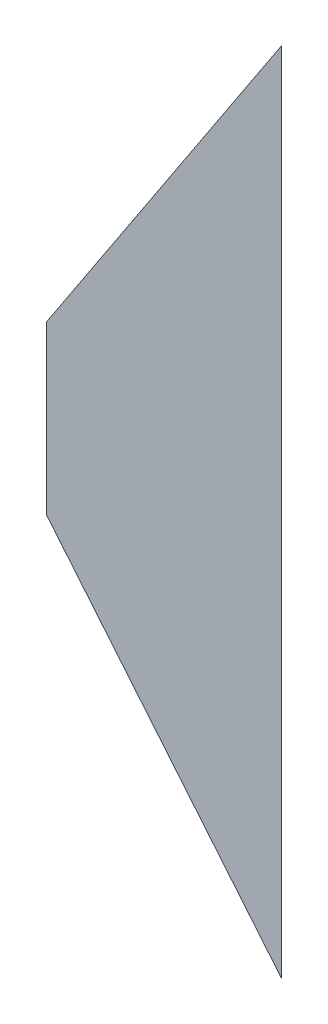
ISO-10303-21;
HEADER;
FILE_DESCRIPTION(('STEP AP214'),'2;1');
FILE_NAME('part.step','',(''),(''),'','','');
FILE_SCHEMA(('AUTOMOTIVE_DESIGN { 1 0 10303 214 1 1 1 1 }'));
ENDSEC;
DATA;
#1=APPLICATION_CONTEXT('core data for automotive mechanical design processes');
#2=APPLICATION_PROTOCOL_DEFINITION('international standard','automotive_design',2000,#1);
#3=PRODUCT_CONTEXT('',#1,'mechanical');
#4=PRODUCT('Part','Part','',(#3));
#5=PRODUCT_RELATED_PRODUCT_CATEGORY('part','',(#4));
#6=PRODUCT_DEFINITION_FORMATION('','',#4);
#7=PRODUCT_DEFINITION_CONTEXT('part definition',#1,'design');
#8=PRODUCT_DEFINITION('design','',#6,#7);
#9=PRODUCT_DEFINITION_SHAPE('','',#8);
#10=(LENGTH_UNIT() NAMED_UNIT(*) SI_UNIT(.MILLI.,.METRE.));
#11=(NAMED_UNIT(*) PLANE_ANGLE_UNIT() SI_UNIT($,.RADIAN.));
#12=(NAMED_UNIT(*) SI_UNIT($,.STERADIAN.) SOLID_ANGLE_UNIT());
#13=UNCERTAINTY_MEASURE_WITH_UNIT(LENGTH_MEASURE(1.E-05),#10,'distance_accuracy_value','');
#14=(GEOMETRIC_REPRESENTATION_CONTEXT(3) GLOBAL_UNCERTAINTY_ASSIGNED_CONTEXT((#13)) GLOBAL_UNIT_ASSIGNED_CONTEXT((#10,
#11,#12)) REPRESENTATION_CONTEXT('',''));
#15=CARTESIAN_POINT('',(0.,0.,0.));
#16=DIRECTION('',(0.,0.,1.));
#17=DIRECTION('',(1.,0.,0.));
#18=AXIS2_PLACEMENT_3D('',#15,#16,#17);
#19=CARTESIAN_POINT('',(0.,0.,0.));
#20=DIRECTION('',(1.,0.,0.));
#21=DIRECTION('',(0.,0.,-1.));
#22=AXIS2_PLACEMENT_3D('',#19,#20,#21);
#23=PLANE('',#22);
#24=DIRECTION('',(0.,0.,1.));
#25=VECTOR('',#24,1.);
#26=CARTESIAN_POINT('',(0.,0.,-2.6));
#27=LINE('',#26,#25);
#28=CARTESIAN_POINT('',(0.,0.,-2.6));
#29=VERTEX_POINT('',#28);
#30=CARTESIAN_POINT('',(0.,0.,0.));
#31=VERTEX_POINT('',#30);
#32=EDGE_CURVE('E81',#29,#31,#27,.T.);
#33=ORIENTED_EDGE('',*,*,#32,.F.);
#34=DIRECTION('',(0.,1.,0.));
#35=VECTOR('',#34,1.);
#36=CARTESIAN_POINT('',(0.,-5.00000000000001,-2.6));
#37=LINE('',#36,#35);
#38=CARTESIAN_POINT('',(0.,-5.00000000000001,-2.6));
#39=VERTEX_POINT('',#38);
#40=EDGE_CURVE('E71',#39,#29,#37,.T.);
#41=ORIENTED_EDGE('',*,*,#40,.F.);
#42=DIRECTION('',(0.,0.,-1.));
#43=VECTOR('',#42,1.);
#44=CARTESIAN_POINT('',(0.,-5.00000000000001,0.));
#45=LINE('',#44,#43);
#46=CARTESIAN_POINT('',(0.,-5.00000000000001,0.));
#47=VERTEX_POINT('',#46);
#48=EDGE_CURVE('E97',#47,#39,#45,.T.);
#49=ORIENTED_EDGE('',*,*,#48,.F.);
#50=DIRECTION('',(0.,-1.,0.));
#51=VECTOR('',#50,1.);
#52=CARTESIAN_POINT('',(0.,0.,0.));
#53=LINE('',#52,#51);
#54=EDGE_CURVE('E101',#31,#47,#53,.T.);
#55=ORIENTED_EDGE('',*,*,#54,.F.);
#56=EDGE_LOOP('',(#33,#41,#49,#55));
#57=FACE_BOUND('',#56,.T.);
#58=ADVANCED_FACE('F37',(#57),#23,.F.);
#59=CARTESIAN_POINT('',(6.9999999999996,-13.4585481156725,0.));
#60=DIRECTION('',(0.,0.,-1.));
#61=DIRECTION('',(-1.,0.,0.));
#62=AXIS2_PLACEMENT_3D('',#59,#60,#61);
#63=PLANE('',#62);
#64=DIRECTION('',(0.,1.,0.));
#65=VECTOR('',#64,1.);
#66=CARTESIAN_POINT('',(6.9999999999996,-13.4585481156725,0.));
#67=LINE('',#66,#65);
#68=CARTESIAN_POINT('',(6.9999999999996,-13.4585481156725,0.));
#69=VERTEX_POINT('',#68);
#70=CARTESIAN_POINT('',(6.99999999999957,10.6243556529812,0.));
#71=VERTEX_POINT('',#70);
#72=EDGE_CURVE('E87',#69,#71,#67,.T.);
#73=ORIENTED_EDGE('',*,*,#72,.T.);
#74=DIRECTION('',(-0.550180959322901,-0.835045455049324,0.));
#75=VECTOR('',#74,1.);
#76=CARTESIAN_POINT('',(6.99999999999957,10.6243556529812,0.));
#77=LINE('',#76,#75);
#78=EDGE_CURVE('E48',#71,#31,#77,.T.);
#79=ORIENTED_EDGE('',*,*,#78,.T.);
#80=ORIENTED_EDGE('',*,*,#54,.T.);
#81=DIRECTION('',(0.637558105394034,-0.77040227300182,0.));
#82=VECTOR('',#81,1.);
#83=CARTESIAN_POINT('',(0.,-5.00000000000001,0.));
#84=LINE('',#83,#82);
#85=EDGE_CURVE('E12',#47,#69,#84,.T.);
#86=ORIENTED_EDGE('',*,*,#85,.T.);
#87=EDGE_LOOP('',(#73,#79,#80,#86));
#88=FACE_BOUND('',#87,.T.);
#89=ADVANCED_FACE('F137',(#88),#63,.F.);
#90=CARTESIAN_POINT('',(0.,0.,0.));
#91=DIRECTION('',(-0.835045455049324,0.550180959322901,0.));
#92=DIRECTION('',(0.550180959322901,0.835045455049324,0.));
#93=AXIS2_PLACEMENT_3D('',#90,#91,#92);
#94=PLANE('',#93);
#95=ORIENTED_EDGE('',*,*,#78,.F.);
#96=DIRECTION('',(-0.539040867315305,-0.818137412264233,-0.200215179288554));
#97=VECTOR('',#96,1.);
#98=CARTESIAN_POINT('',(3.49999999999979,5.31217782649062,-1.3));
#99=LINE('',#98,#97);
#100=EDGE_CURVE('E78',#71,#29,#99,.T.);
#101=ORIENTED_EDGE('',*,*,#100,.T.);
#102=ORIENTED_EDGE('',*,*,#32,.T.);
#103=EDGE_LOOP('',(#95,#101,#102));
#104=FACE_BOUND('',#103,.T.);
#105=ADVANCED_FACE('F80',(#104),#94,.T.);
#106=CARTESIAN_POINT('',(-1.83410242090568,-2.78373663195673,-3.28123804205072));
#107=DIRECTION('',(-0.348186529603645,0.,0.937425272009758));
#108=DIRECTION('',(0.937425272009759,0.,0.348186529603645));
#109=AXIS2_PLACEMENT_3D('',#106,#107,#108);
#110=PLANE('',#109);
#111=DIRECTION('',(-0.620400067205516,0.749669117060658,-0.230434310676348));
#112=VECTOR('',#111,1.);
#113=CARTESIAN_POINT('',(6.9999999999996,-13.4585481156725,0.));
#114=LINE('',#113,#112);
#115=EDGE_CURVE('E88',#69,#39,#114,.T.);
#116=ORIENTED_EDGE('',*,*,#115,.T.);
#117=ORIENTED_EDGE('',*,*,#40,.T.);
#118=ORIENTED_EDGE('',*,*,#100,.F.);
#119=ORIENTED_EDGE('',*,*,#72,.F.);
#120=EDGE_LOOP('',(#116,#117,#118,#119));
#121=FACE_BOUND('',#120,.T.);
#122=ADVANCED_FACE('F94',(#121),#110,.F.);
#123=CARTESIAN_POINT('',(6.9999999999996,-13.4585481156725,0.));
#124=DIRECTION('',(-0.77040227300182,-0.637558105394034,0.));
#125=DIRECTION('',(-0.637558105394034,0.77040227300182,0.));
#126=AXIS2_PLACEMENT_3D('',#123,#124,#125);
#127=PLANE('',#126);
#128=ORIENTED_EDGE('',*,*,#85,.F.);
#129=ORIENTED_EDGE('',*,*,#48,.T.);
#130=ORIENTED_EDGE('',*,*,#115,.F.);
#131=EDGE_LOOP('',(#128,#129,#130));
#132=FACE_BOUND('',#131,.T.);
#133=ADVANCED_FACE('F153',(#132),#127,.T.);
#134=CLOSED_SHELL('',(#58,#89,#105,#122,#133));
#135=MANIFOLD_SOLID_BREP('B2',#134);
#136=ADVANCED_BREP_SHAPE_REPRESENTATION('',(#18,#135),#14);
#137=SHAPE_DEFINITION_REPRESENTATION(#9,#136);
ENDSEC;
END-ISO-10303-21;
